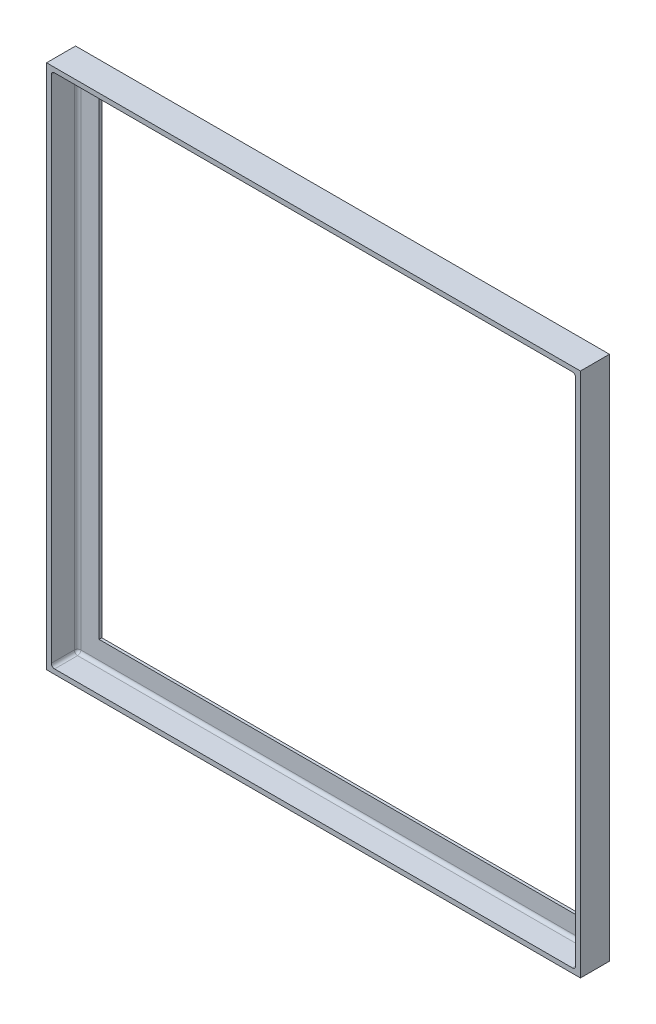
ISO-10303-21;
HEADER;
FILE_DESCRIPTION(('STEP AP214'),'2;1');
FILE_NAME('part.step','',(''),(''),'','','');
FILE_SCHEMA(('AUTOMOTIVE_DESIGN { 1 0 10303 214 1 1 1 1 }'));
ENDSEC;
DATA;
#1=APPLICATION_CONTEXT('core data for automotive mechanical design processes');
#2=APPLICATION_PROTOCOL_DEFINITION('international standard','automotive_design',2000,#1);
#3=PRODUCT_CONTEXT('',#1,'mechanical');
#4=PRODUCT('Part','Part','',(#3));
#5=PRODUCT_RELATED_PRODUCT_CATEGORY('part','',(#4));
#6=PRODUCT_DEFINITION_FORMATION('','',#4);
#7=PRODUCT_DEFINITION_CONTEXT('part definition',#1,'design');
#8=PRODUCT_DEFINITION('design','',#6,#7);
#9=PRODUCT_DEFINITION_SHAPE('','',#8);
#10=(LENGTH_UNIT() NAMED_UNIT(*) SI_UNIT(.MILLI.,.METRE.));
#11=(NAMED_UNIT(*) PLANE_ANGLE_UNIT() SI_UNIT($,.RADIAN.));
#12=(NAMED_UNIT(*) SI_UNIT($,.STERADIAN.) SOLID_ANGLE_UNIT());
#13=UNCERTAINTY_MEASURE_WITH_UNIT(LENGTH_MEASURE(1.E-05),#10,'distance_accuracy_value','');
#14=(GEOMETRIC_REPRESENTATION_CONTEXT(3) GLOBAL_UNCERTAINTY_ASSIGNED_CONTEXT((#13)) GLOBAL_UNIT_ASSIGNED_CONTEXT((#10,
#11,#12)) REPRESENTATION_CONTEXT('',''));
#15=CARTESIAN_POINT('',(0.,0.,0.));
#16=DIRECTION('',(0.,0.,1.));
#17=DIRECTION('',(1.,0.,0.));
#18=AXIS2_PLACEMENT_3D('',#15,#16,#17);
#19=CARTESIAN_POINT('',(0.,228.6,2.65684));
#20=DIRECTION('',(0.,1.,0.));
#21=DIRECTION('',(-1.,0.,0.));
#22=AXIS2_PLACEMENT_3D('',#19,#20,#21);
#23=PLANE('',#22);
#24=DIRECTION('',(1.,0.,0.));
#25=VECTOR('',#24,1.);
#26=CARTESIAN_POINT('',(0.,228.6,0.));
#27=LINE('',#26,#25);
#28=CARTESIAN_POINT('',(-232.56875,228.6,0.));
#29=VERTEX_POINT('',#28);
#30=CARTESIAN_POINT('',(232.56875,228.6,0.));
#31=VERTEX_POINT('',#30);
#32=EDGE_CURVE('E209',#29,#31,#27,.T.);
#33=ORIENTED_EDGE('',*,*,#32,.T.);
#34=DIRECTION('',(0.,0.,-1.));
#35=VECTOR('',#34,1.);
#36=CARTESIAN_POINT('',(232.56875,228.6,2.65684));
#37=LINE('',#36,#35);
#38=CARTESIAN_POINT('',(232.56875,228.6,2.65684));
#39=VERTEX_POINT('',#38);
#40=EDGE_CURVE('E226',#39,#31,#37,.T.);
#41=ORIENTED_EDGE('',*,*,#40,.F.);
#42=DIRECTION('',(1.,0.,0.));
#43=VECTOR('',#42,1.);
#44=CARTESIAN_POINT('',(0.,228.6,2.65684));
#45=LINE('',#44,#43);
#46=CARTESIAN_POINT('',(-232.56875,228.6,2.65684));
#47=VERTEX_POINT('',#46);
#48=EDGE_CURVE('E191',#47,#39,#45,.T.);
#49=ORIENTED_EDGE('',*,*,#48,.F.);
#50=DIRECTION('',(0.,0.,-1.));
#51=VECTOR('',#50,1.);
#52=CARTESIAN_POINT('',(-232.56875,228.6,2.65684));
#53=LINE('',#52,#51);
#54=EDGE_CURVE('E217',#47,#29,#53,.T.);
#55=ORIENTED_EDGE('',*,*,#54,.T.);
#56=EDGE_LOOP('',(#33,#41,#49,#55));
#57=FACE_BOUND('',#56,.T.);
#58=ADVANCED_FACE('F33',(#57),#23,.F.);
#59=CARTESIAN_POINT('',(232.56875,0.,2.65684));
#60=DIRECTION('',(1.,0.,0.));
#61=DIRECTION('',(0.,1.,0.));
#62=AXIS2_PLACEMENT_3D('',#59,#60,#61);
#63=PLANE('',#62);
#64=DIRECTION('',(0.,-1.,0.));
#65=VECTOR('',#64,1.);
#66=CARTESIAN_POINT('',(232.56875,0.,0.));
#67=LINE('',#66,#65);
#68=CARTESIAN_POINT('',(232.56875,-228.6,0.));
#69=VERTEX_POINT('',#68);
#70=EDGE_CURVE('E212',#31,#69,#67,.T.);
#71=ORIENTED_EDGE('',*,*,#70,.T.);
#72=DIRECTION('',(0.,0.,-1.));
#73=VECTOR('',#72,1.);
#74=CARTESIAN_POINT('',(232.56875,-228.6,2.65684));
#75=LINE('',#74,#73);
#76=CARTESIAN_POINT('',(232.56875,-228.6,2.65684));
#77=VERTEX_POINT('',#76);
#78=EDGE_CURVE('E223',#77,#69,#75,.T.);
#79=ORIENTED_EDGE('',*,*,#78,.F.);
#80=DIRECTION('',(0.,-1.,0.));
#81=VECTOR('',#80,1.);
#82=CARTESIAN_POINT('',(232.56875,0.,2.65684));
#83=LINE('',#82,#81);
#84=EDGE_CURVE('E194',#39,#77,#83,.T.);
#85=ORIENTED_EDGE('',*,*,#84,.F.);
#86=ORIENTED_EDGE('',*,*,#40,.T.);
#87=EDGE_LOOP('',(#71,#79,#85,#86));
#88=FACE_BOUND('',#87,.T.);
#89=ADVANCED_FACE('F385',(#88),#63,.F.);
#90=CARTESIAN_POINT('',(0.,-228.6,2.65684));
#91=DIRECTION('',(0.,-1.,0.));
#92=DIRECTION('',(1.,0.,0.));
#93=AXIS2_PLACEMENT_3D('',#90,#91,#92);
#94=PLANE('',#93);
#95=DIRECTION('',(-1.,0.,0.));
#96=VECTOR('',#95,1.);
#97=CARTESIAN_POINT('',(0.,-228.6,0.));
#98=LINE('',#97,#96);
#99=CARTESIAN_POINT('',(-232.56875,-228.6,0.));
#100=VERTEX_POINT('',#99);
#101=EDGE_CURVE('E214',#69,#100,#98,.T.);
#102=ORIENTED_EDGE('',*,*,#101,.T.);
#103=DIRECTION('',(0.,0.,-1.));
#104=VECTOR('',#103,1.);
#105=CARTESIAN_POINT('',(-232.56875,-228.6,2.65684));
#106=LINE('',#105,#104);
#107=CARTESIAN_POINT('',(-232.56875,-228.6,2.65684));
#108=VERTEX_POINT('',#107);
#109=EDGE_CURVE('E220',#108,#100,#106,.T.);
#110=ORIENTED_EDGE('',*,*,#109,.F.);
#111=DIRECTION('',(-1.,0.,0.));
#112=VECTOR('',#111,1.);
#113=CARTESIAN_POINT('',(0.,-228.6,2.65684));
#114=LINE('',#113,#112);
#115=EDGE_CURVE('E197',#77,#108,#114,.T.);
#116=ORIENTED_EDGE('',*,*,#115,.F.);
#117=ORIENTED_EDGE('',*,*,#78,.T.);
#118=EDGE_LOOP('',(#102,#110,#116,#117));
#119=FACE_BOUND('',#118,.T.);
#120=ADVANCED_FACE('F391',(#119),#94,.F.);
#121=CARTESIAN_POINT('',(0.,254.,2.65684));
#122=DIRECTION('',(0.,-1.,0.));
#123=DIRECTION('',(1.,0.,0.));
#124=AXIS2_PLACEMENT_3D('',#121,#122,#123);
#125=PLANE('',#124);
#126=DIRECTION('',(-1.,0.,0.));
#127=VECTOR('',#126,1.);
#128=CARTESIAN_POINT('',(0.,254.,0.));
#129=LINE('',#128,#127);
#130=CARTESIAN_POINT('',(257.96875,254.,0.));
#131=VERTEX_POINT('',#130);
#132=CARTESIAN_POINT('',(-257.96875,254.,0.));
#133=VERTEX_POINT('',#132);
#134=EDGE_CURVE('E190',#131,#133,#129,.T.);
#135=ORIENTED_EDGE('',*,*,#134,.T.);
#136=DIRECTION('',(0.,0.,-1.));
#137=VECTOR('',#136,1.);
#138=CARTESIAN_POINT('',(-257.96875,254.,2.65684));
#139=LINE('',#138,#137);
#140=CARTESIAN_POINT('',(-257.96875,254.,28.05684));
#141=VERTEX_POINT('',#140);
#142=EDGE_CURVE('E169',#141,#133,#139,.T.);
#143=ORIENTED_EDGE('',*,*,#142,.F.);
#144=DIRECTION('',(1.,0.,0.));
#145=VECTOR('',#144,1.);
#146=CARTESIAN_POINT('',(0.,254.,28.05684));
#147=LINE('',#146,#145);
#148=CARTESIAN_POINT('',(257.96875,254.,28.05684));
#149=VERTEX_POINT('',#148);
#150=EDGE_CURVE('E179',#141,#149,#147,.T.);
#151=ORIENTED_EDGE('',*,*,#150,.T.);
#152=DIRECTION('',(0.,0.,-1.));
#153=VECTOR('',#152,1.);
#154=CARTESIAN_POINT('',(257.96875,254.,2.65684));
#155=LINE('',#154,#153);
#156=EDGE_CURVE('E201',#149,#131,#155,.T.);
#157=ORIENTED_EDGE('',*,*,#156,.T.);
#158=EDGE_LOOP('',(#135,#143,#151,#157));
#159=FACE_BOUND('',#158,.T.);
#160=ADVANCED_FACE('F405',(#159),#125,.F.);
#161=CARTESIAN_POINT('',(-257.96875,-1.12757025938492E-13,2.65684));
#162=DIRECTION('',(1.,0.,0.));
#163=DIRECTION('',(0.,1.,0.));
#164=AXIS2_PLACEMENT_3D('',#161,#162,#163);
#165=PLANE('',#164);
#166=DIRECTION('',(0.,-1.,0.));
#167=VECTOR('',#166,1.);
#168=CARTESIAN_POINT('',(-257.96875,-1.12757025938492E-13,0.));
#169=LINE('',#168,#167);
#170=CARTESIAN_POINT('',(-257.96875,-254.,0.));
#171=VERTEX_POINT('',#170);
#172=EDGE_CURVE('E165',#133,#171,#169,.T.);
#173=ORIENTED_EDGE('',*,*,#172,.T.);
#174=DIRECTION('',(0.,0.,-1.));
#175=VECTOR('',#174,1.);
#176=CARTESIAN_POINT('',(-257.96875,-254.,2.65684));
#177=LINE('',#176,#175);
#178=CARTESIAN_POINT('',(-257.96875,-254.,28.05684));
#179=VERTEX_POINT('',#178);
#180=EDGE_CURVE('E159',#179,#171,#177,.T.);
#181=ORIENTED_EDGE('',*,*,#180,.F.);
#182=DIRECTION('',(0.,1.,0.));
#183=VECTOR('',#182,1.);
#184=CARTESIAN_POINT('',(-257.96875,0.,28.05684));
#185=LINE('',#184,#183);
#186=EDGE_CURVE('E163',#179,#141,#185,.T.);
#187=ORIENTED_EDGE('',*,*,#186,.T.);
#188=ORIENTED_EDGE('',*,*,#142,.T.);
#189=EDGE_LOOP('',(#173,#181,#187,#188));
#190=FACE_BOUND('',#189,.T.);
#191=ADVANCED_FACE('F161',(#190),#165,.F.);
#192=CARTESIAN_POINT('',(0.,-254.,2.65684));
#193=DIRECTION('',(0.,1.,0.));
#194=DIRECTION('',(0.,0.,1.));
#195=AXIS2_PLACEMENT_3D('',#192,#193,#194);
#196=PLANE('',#195);
#197=DIRECTION('',(1.,0.,0.));
#198=VECTOR('',#197,1.);
#199=CARTESIAN_POINT('',(0.,-254.,0.));
#200=LINE('',#199,#198);
#201=CARTESIAN_POINT('',(257.96875,-254.,0.));
#202=VERTEX_POINT('',#201);
#203=EDGE_CURVE('E205',#171,#202,#200,.T.);
#204=ORIENTED_EDGE('',*,*,#203,.T.);
#205=DIRECTION('',(0.,0.,-1.));
#206=VECTOR('',#205,1.);
#207=CARTESIAN_POINT('',(257.96875,-254.,2.65684));
#208=LINE('',#207,#206);
#209=CARTESIAN_POINT('',(257.96875,-254.,28.05684));
#210=VERTEX_POINT('',#209);
#211=EDGE_CURVE('E170',#210,#202,#208,.T.);
#212=ORIENTED_EDGE('',*,*,#211,.F.);
#213=DIRECTION('',(-1.,0.,0.));
#214=VECTOR('',#213,1.);
#215=CARTESIAN_POINT('',(0.,-254.,28.05684));
#216=LINE('',#215,#214);
#217=EDGE_CURVE('E176',#210,#179,#216,.T.);
#218=ORIENTED_EDGE('',*,*,#217,.T.);
#219=ORIENTED_EDGE('',*,*,#180,.T.);
#220=EDGE_LOOP('',(#204,#212,#218,#219));
#221=FACE_BOUND('',#220,.T.);
#222=ADVANCED_FACE('F182',(#221),#196,.F.);
#223=CARTESIAN_POINT('',(257.96875,0.,2.65684));
#224=DIRECTION('',(-1.,0.,0.));
#225=DIRECTION('',(0.,-1.,0.));
#226=AXIS2_PLACEMENT_3D('',#223,#224,#225);
#227=PLANE('',#226);
#228=DIRECTION('',(0.,1.,0.));
#229=VECTOR('',#228,1.);
#230=CARTESIAN_POINT('',(257.96875,0.,0.));
#231=LINE('',#230,#229);
#232=EDGE_CURVE('E207',#202,#131,#231,.T.);
#233=ORIENTED_EDGE('',*,*,#232,.T.);
#234=ORIENTED_EDGE('',*,*,#156,.F.);
#235=DIRECTION('',(0.,-1.,0.));
#236=VECTOR('',#235,1.);
#237=CARTESIAN_POINT('',(257.96875,0.,28.05684));
#238=LINE('',#237,#236);
#239=EDGE_CURVE('E184',#149,#210,#238,.T.);
#240=ORIENTED_EDGE('',*,*,#239,.T.);
#241=ORIENTED_EDGE('',*,*,#211,.T.);
#242=EDGE_LOOP('',(#233,#234,#240,#241));
#243=FACE_BOUND('',#242,.T.);
#244=ADVANCED_FACE('F396',(#243),#227,.F.);
#245=CARTESIAN_POINT('',(-232.56875,0.,2.65684));
#246=DIRECTION('',(-1.,0.,0.));
#247=DIRECTION('',(0.,-1.,0.));
#248=AXIS2_PLACEMENT_3D('',#245,#246,#247);
#249=PLANE('',#248);
#250=DIRECTION('',(0.,1.,0.));
#251=VECTOR('',#250,1.);
#252=CARTESIAN_POINT('',(-232.56875,0.,0.));
#253=LINE('',#252,#251);
#254=EDGE_CURVE('E195',#100,#29,#253,.T.);
#255=ORIENTED_EDGE('',*,*,#254,.T.);
#256=ORIENTED_EDGE('',*,*,#54,.F.);
#257=DIRECTION('',(0.,1.,0.));
#258=VECTOR('',#257,1.);
#259=CARTESIAN_POINT('',(-232.56875,0.,2.65684));
#260=LINE('',#259,#258);
#261=EDGE_CURVE('E199',#108,#47,#260,.T.);
#262=ORIENTED_EDGE('',*,*,#261,.F.);
#263=ORIENTED_EDGE('',*,*,#109,.T.);
#264=EDGE_LOOP('',(#255,#256,#262,#263));
#265=FACE_BOUND('',#264,.T.);
#266=ADVANCED_FACE('F399',(#265),#249,.F.);
#267=CARTESIAN_POINT('',(0.,0.,2.65684));
#268=DIRECTION('',(0.,0.,1.));
#269=DIRECTION('',(1.,0.,0.));
#270=AXIS2_PLACEMENT_3D('',#267,#268,#269);
#271=PLANE('',#270);
#272=DIRECTION('',(0.,1.,0.));
#273=VECTOR('',#272,1.);
#274=CARTESIAN_POINT('',(250.208148118038,249.414398118081,2.65684));
#275=LINE('',#274,#273);
#276=CARTESIAN_POINT('',(250.208148118038,-246.239398118081,2.65684));
#277=VERTEX_POINT('',#276);
#278=CARTESIAN_POINT('',(250.208148118038,246.239398118081,2.65684));
#279=VERTEX_POINT('',#278);
#280=EDGE_CURVE('E256',#277,#279,#275,.T.);
#281=ORIENTED_EDGE('',*,*,#280,.T.);
#282=DIRECTION('',(-1.,0.,0.));
#283=VECTOR('',#282,1.);
#284=CARTESIAN_POINT('',(-253.383148118038,246.239398118081,2.65684));
#285=LINE('',#284,#283);
#286=CARTESIAN_POINT('',(-250.208148118038,246.239398118081,2.65684));
#287=VERTEX_POINT('',#286);
#288=EDGE_CURVE('E258',#279,#287,#285,.T.);
#289=ORIENTED_EDGE('',*,*,#288,.T.);
#290=DIRECTION('',(0.,-1.,0.));
#291=VECTOR('',#290,1.);
#292=CARTESIAN_POINT('',(-250.208148118038,-249.414398118081,2.65684));
#293=LINE('',#292,#291);
#294=CARTESIAN_POINT('',(-250.208148118038,-246.239398118081,2.65684));
#295=VERTEX_POINT('',#294);
#296=EDGE_CURVE('E252',#287,#295,#293,.T.);
#297=ORIENTED_EDGE('',*,*,#296,.T.);
#298=DIRECTION('',(1.,0.,0.));
#299=VECTOR('',#298,1.);
#300=CARTESIAN_POINT('',(253.383148118038,-246.239398118081,2.65684));
#301=LINE('',#300,#299);
#302=EDGE_CURVE('E254',#295,#277,#301,.T.);
#303=ORIENTED_EDGE('',*,*,#302,.T.);
#304=EDGE_LOOP('',(#281,#289,#297,#303));
#305=FACE_BOUND('',#304,.T.);
#306=ORIENTED_EDGE('',*,*,#48,.T.);
#307=ORIENTED_EDGE('',*,*,#84,.T.);
#308=ORIENTED_EDGE('',*,*,#115,.T.);
#309=ORIENTED_EDGE('',*,*,#261,.T.);
#310=EDGE_LOOP('',(#306,#307,#308,#309));
#311=FACE_BOUND('',#310,.T.);
#312=ADVANCED_FACE('F367',(#305,#311),#271,.T.);
#313=CARTESIAN_POINT('',(0.,0.,0.));
#314=DIRECTION('',(0.,0.,1.));
#315=DIRECTION('',(1.,0.,0.));
#316=AXIS2_PLACEMENT_3D('',#313,#314,#315);
#317=PLANE('',#316);
#318=ORIENTED_EDGE('',*,*,#134,.F.);
#319=ORIENTED_EDGE('',*,*,#232,.F.);
#320=ORIENTED_EDGE('',*,*,#203,.F.);
#321=ORIENTED_EDGE('',*,*,#172,.F.);
#322=EDGE_LOOP('',(#318,#319,#320,#321));
#323=FACE_BOUND('',#322,.T.);
#324=ORIENTED_EDGE('',*,*,#32,.F.);
#325=ORIENTED_EDGE('',*,*,#254,.F.);
#326=ORIENTED_EDGE('',*,*,#101,.F.);
#327=ORIENTED_EDGE('',*,*,#70,.F.);
#328=EDGE_LOOP('',(#324,#325,#326,#327));
#329=FACE_BOUND('',#328,.T.);
#330=ADVANCED_FACE('F374',(#323,#329),#317,.F.);
#331=CARTESIAN_POINT('',(-253.383148118038,0.,28.05684));
#332=DIRECTION('',(1.,0.,0.));
#333=DIRECTION('',(0.,0.,-1.));
#334=AXIS2_PLACEMENT_3D('',#331,#332,#333);
#335=PLANE('',#334);
#336=DIRECTION('',(0.,-1.,0.));
#337=VECTOR('',#336,1.);
#338=CARTESIAN_POINT('',(-253.383148118038,249.414398118081,5.83184));
#339=LINE('',#338,#337);
#340=CARTESIAN_POINT('',(-253.383148118038,-246.239398118081,5.83184));
#341=VERTEX_POINT('',#340);
#342=CARTESIAN_POINT('',(-253.383148118038,246.239398118081,5.83184));
#343=VERTEX_POINT('',#342);
#344=EDGE_CURVE('E240',#341,#343,#339,.F.);
#345=ORIENTED_EDGE('',*,*,#344,.T.);
#346=DIRECTION('',(0.,0.,-1.));
#347=VECTOR('',#346,1.);
#348=CARTESIAN_POINT('',(-253.383148118038,246.239398118081,28.05684));
#349=LINE('',#348,#347);
#350=CARTESIAN_POINT('',(-253.383148118038,246.239398118081,28.05684));
#351=VERTEX_POINT('',#350);
#352=EDGE_CURVE('E244',#343,#351,#349,.F.);
#353=ORIENTED_EDGE('',*,*,#352,.T.);
#354=DIRECTION('',(0.,-1.,0.));
#355=VECTOR('',#354,1.);
#356=CARTESIAN_POINT('',(-253.383148118038,0.,28.05684));
#357=LINE('',#356,#355);
#358=CARTESIAN_POINT('',(-253.383148118038,-246.239398118081,28.05684));
#359=VERTEX_POINT('',#358);
#360=EDGE_CURVE('E304',#351,#359,#357,.T.);
#361=ORIENTED_EDGE('',*,*,#360,.T.);
#362=DIRECTION('',(0.,0.,-1.));
#363=VECTOR('',#362,1.);
#364=CARTESIAN_POINT('',(-253.383148118038,-246.239398118081,2.65684));
#365=LINE('',#364,#363);
#366=EDGE_CURVE('E242',#359,#341,#365,.T.);
#367=ORIENTED_EDGE('',*,*,#366,.T.);
#368=EDGE_LOOP('',(#345,#353,#361,#367));
#369=FACE_BOUND('',#368,.T.);
#370=ADVANCED_FACE('F372',(#369),#335,.T.);
#371=CARTESIAN_POINT('',(0.,249.414398118081,28.05684));
#372=DIRECTION('',(0.,-1.,0.));
#373=DIRECTION('',(0.,0.,-1.));
#374=AXIS2_PLACEMENT_3D('',#371,#372,#373);
#375=PLANE('',#374);
#376=DIRECTION('',(-1.,0.,0.));
#377=VECTOR('',#376,1.);
#378=CARTESIAN_POINT('',(0.,249.414398118081,28.05684));
#379=LINE('',#378,#377);
#380=CARTESIAN_POINT('',(250.208148118038,249.414398118081,28.05684));
#381=VERTEX_POINT('',#380);
#382=CARTESIAN_POINT('',(-250.208148118038,249.414398118081,28.05684));
#383=VERTEX_POINT('',#382);
#384=EDGE_CURVE('E308',#381,#383,#379,.T.);
#385=ORIENTED_EDGE('',*,*,#384,.T.);
#386=DIRECTION('',(0.,0.,-1.));
#387=VECTOR('',#386,1.);
#388=CARTESIAN_POINT('',(-250.208148118038,249.414398118081,2.65684));
#389=LINE('',#388,#387);
#390=CARTESIAN_POINT('',(-250.208148118038,249.414398118081,5.83184));
#391=VERTEX_POINT('',#390);
#392=EDGE_CURVE('E237',#383,#391,#389,.T.);
#393=ORIENTED_EDGE('',*,*,#392,.T.);
#394=DIRECTION('',(-1.,0.,0.));
#395=VECTOR('',#394,1.);
#396=CARTESIAN_POINT('',(253.383148118038,249.414398118081,5.83184));
#397=LINE('',#396,#395);
#398=CARTESIAN_POINT('',(250.208148118038,249.414398118081,5.83184));
#399=VERTEX_POINT('',#398);
#400=EDGE_CURVE('E229',#391,#399,#397,.F.);
#401=ORIENTED_EDGE('',*,*,#400,.T.);
#402=DIRECTION('',(0.,0.,-1.));
#403=VECTOR('',#402,1.);
#404=CARTESIAN_POINT('',(250.208148118038,249.414398118081,28.05684));
#405=LINE('',#404,#403);
#406=EDGE_CURVE('E235',#399,#381,#405,.F.);
#407=ORIENTED_EDGE('',*,*,#406,.T.);
#408=EDGE_LOOP('',(#385,#393,#401,#407));
#409=FACE_BOUND('',#408,.T.);
#410=ADVANCED_FACE('F345',(#409),#375,.T.);
#411=CARTESIAN_POINT('',(253.383148118038,0.,28.05684));
#412=DIRECTION('',(-1.,0.,0.));
#413=DIRECTION('',(0.,0.,1.));
#414=AXIS2_PLACEMENT_3D('',#411,#412,#413);
#415=PLANE('',#414);
#416=DIRECTION('',(0.,1.,0.));
#417=VECTOR('',#416,1.);
#418=CARTESIAN_POINT('',(253.383148118038,0.,28.05684));
#419=LINE('',#418,#417);
#420=CARTESIAN_POINT('',(253.383148118038,-246.239398118081,28.05684));
#421=VERTEX_POINT('',#420);
#422=CARTESIAN_POINT('',(253.383148118038,246.239398118081,28.05684));
#423=VERTEX_POINT('',#422);
#424=EDGE_CURVE('E314',#421,#423,#419,.T.);
#425=ORIENTED_EDGE('',*,*,#424,.T.);
#426=DIRECTION('',(0.,0.,-1.));
#427=VECTOR('',#426,1.);
#428=CARTESIAN_POINT('',(253.383148118038,246.239398118081,2.65684));
#429=LINE('',#428,#427);
#430=CARTESIAN_POINT('',(253.383148118038,246.239398118081,5.83184));
#431=VERTEX_POINT('',#430);
#432=EDGE_CURVE('E250',#423,#431,#429,.T.);
#433=ORIENTED_EDGE('',*,*,#432,.T.);
#434=DIRECTION('',(0.,1.,0.));
#435=VECTOR('',#434,1.);
#436=CARTESIAN_POINT('',(253.383148118038,-249.414398118081,5.83184));
#437=LINE('',#436,#435);
#438=CARTESIAN_POINT('',(253.383148118038,-246.239398118081,5.83184));
#439=VERTEX_POINT('',#438);
#440=EDGE_CURVE('E246',#431,#439,#437,.F.);
#441=ORIENTED_EDGE('',*,*,#440,.T.);
#442=DIRECTION('',(0.,0.,-1.));
#443=VECTOR('',#442,1.);
#444=CARTESIAN_POINT('',(253.383148118038,-246.239398118081,28.05684));
#445=LINE('',#444,#443);
#446=EDGE_CURVE('E248',#439,#421,#445,.F.);
#447=ORIENTED_EDGE('',*,*,#446,.T.);
#448=EDGE_LOOP('',(#425,#433,#441,#447));
#449=FACE_BOUND('',#448,.T.);
#450=ADVANCED_FACE('F355',(#449),#415,.T.);
#451=CARTESIAN_POINT('',(0.,-249.414398118081,28.05684));
#452=DIRECTION('',(0.,1.,0.));
#453=DIRECTION('',(0.,0.,1.));
#454=AXIS2_PLACEMENT_3D('',#451,#452,#453);
#455=PLANE('',#454);
#456=DIRECTION('',(1.,0.,0.));
#457=VECTOR('',#456,1.);
#458=CARTESIAN_POINT('',(0.,-249.414398118081,28.05684));
#459=LINE('',#458,#457);
#460=CARTESIAN_POINT('',(-250.208148118038,-249.414398118081,28.05684));
#461=VERTEX_POINT('',#460);
#462=CARTESIAN_POINT('',(250.208148118038,-249.414398118081,28.05684));
#463=VERTEX_POINT('',#462);
#464=EDGE_CURVE('E180',#461,#463,#459,.T.);
#465=ORIENTED_EDGE('',*,*,#464,.T.);
#466=DIRECTION('',(0.,0.,-1.));
#467=VECTOR('',#466,1.);
#468=CARTESIAN_POINT('',(250.208148118038,-249.414398118081,2.65684));
#469=LINE('',#468,#467);
#470=CARTESIAN_POINT('',(250.208148118038,-249.414398118081,5.83184));
#471=VERTEX_POINT('',#470);
#472=EDGE_CURVE('E55',#463,#471,#469,.T.);
#473=ORIENTED_EDGE('',*,*,#472,.T.);
#474=DIRECTION('',(1.,0.,0.));
#475=VECTOR('',#474,1.);
#476=CARTESIAN_POINT('',(-253.383148118038,-249.414398118081,5.83184));
#477=LINE('',#476,#475);
#478=CARTESIAN_POINT('',(-250.208148118038,-249.414398118081,5.83184));
#479=VERTEX_POINT('',#478);
#480=EDGE_CURVE('E50',#471,#479,#477,.F.);
#481=ORIENTED_EDGE('',*,*,#480,.T.);
#482=DIRECTION('',(0.,0.,-1.));
#483=VECTOR('',#482,1.);
#484=CARTESIAN_POINT('',(-250.208148118038,-249.414398118081,28.05684));
#485=LINE('',#484,#483);
#486=EDGE_CURVE('E262',#479,#461,#485,.F.);
#487=ORIENTED_EDGE('',*,*,#486,.T.);
#488=EDGE_LOOP('',(#465,#473,#481,#487));
#489=FACE_BOUND('',#488,.T.);
#490=ADVANCED_FACE('F319',(#489),#455,.T.);
#491=CARTESIAN_POINT('',(0.,0.,28.05684));
#492=DIRECTION('',(0.,0.,1.));
#493=DIRECTION('',(1.,0.,0.));
#494=AXIS2_PLACEMENT_3D('',#491,#492,#493);
#495=PLANE('',#494);
#496=ORIENTED_EDGE('',*,*,#360,.F.);
#497=CARTESIAN_POINT('',(-250.208148118038,246.239398118081,28.05684));
#498=DIRECTION('',(0.,0.,1.));
#499=DIRECTION('',(1.,0.,0.));
#500=AXIS2_PLACEMENT_3D('',#497,#498,#499);
#501=CIRCLE('',#500,3.175);
#502=EDGE_CURVE('E265',#351,#383,#501,.F.);
#503=ORIENTED_EDGE('',*,*,#502,.T.);
#504=ORIENTED_EDGE('',*,*,#384,.F.);
#505=CARTESIAN_POINT('',(250.208148118038,246.239398118081,28.05684));
#506=DIRECTION('',(0.,0.,1.));
#507=DIRECTION('',(1.,0.,0.));
#508=AXIS2_PLACEMENT_3D('',#505,#506,#507);
#509=CIRCLE('',#508,3.175);
#510=EDGE_CURVE('E267',#381,#423,#509,.F.);
#511=ORIENTED_EDGE('',*,*,#510,.T.);
#512=ORIENTED_EDGE('',*,*,#424,.F.);
#513=CARTESIAN_POINT('',(250.208148118038,-246.239398118081,28.05684));
#514=DIRECTION('',(0.,0.,1.));
#515=DIRECTION('',(1.,0.,0.));
#516=AXIS2_PLACEMENT_3D('',#513,#514,#515);
#517=CIRCLE('',#516,3.175);
#518=EDGE_CURVE('E42',#421,#463,#517,.F.);
#519=ORIENTED_EDGE('',*,*,#518,.T.);
#520=ORIENTED_EDGE('',*,*,#464,.F.);
#521=CARTESIAN_POINT('',(-250.208148118038,-246.239398118081,28.05684));
#522=DIRECTION('',(0.,0.,1.));
#523=DIRECTION('',(1.,0.,0.));
#524=AXIS2_PLACEMENT_3D('',#521,#522,#523);
#525=CIRCLE('',#524,3.175);
#526=EDGE_CURVE('E11',#461,#359,#525,.F.);
#527=ORIENTED_EDGE('',*,*,#526,.T.);
#528=EDGE_LOOP('',(#496,#503,#504,#511,#512,#519,#520,#527));
#529=FACE_BOUND('',#528,.T.);
#530=ORIENTED_EDGE('',*,*,#186,.F.);
#531=ORIENTED_EDGE('',*,*,#217,.F.);
#532=ORIENTED_EDGE('',*,*,#239,.F.);
#533=ORIENTED_EDGE('',*,*,#150,.F.);
#534=EDGE_LOOP('',(#530,#531,#532,#533));
#535=FACE_BOUND('',#534,.T.);
#536=ADVANCED_FACE('F174',(#529,#535),#495,.T.);
#537=CARTESIAN_POINT('',(250.208148118038,-246.239398118081,28.05684));
#538=DIRECTION('',(0.,0.,1.));
#539=DIRECTION('',(1.,0.,0.));
#540=AXIS2_PLACEMENT_3D('',#537,#538,#539);
#541=CYLINDRICAL_SURFACE('',#540,3.175);
#542=CARTESIAN_POINT('',(250.208148118038,-246.239398118081,5.83184));
#543=DIRECTION('',(0.,0.,1.));
#544=DIRECTION('',(1.,0.,0.));
#545=AXIS2_PLACEMENT_3D('',#542,#543,#544);
#546=CIRCLE('',#545,3.175);
#547=EDGE_CURVE('E37',#471,#439,#546,.T.);
#548=ORIENTED_EDGE('',*,*,#547,.F.);
#549=ORIENTED_EDGE('',*,*,#472,.F.);
#550=ORIENTED_EDGE('',*,*,#518,.F.);
#551=ORIENTED_EDGE('',*,*,#446,.F.);
#552=EDGE_LOOP('',(#548,#549,#550,#551));
#553=FACE_BOUND('',#552,.T.);
#554=ADVANCED_FACE('F35',(#553),#541,.F.);
#555=CARTESIAN_POINT('',(250.208148118038,-246.239398118081,5.83184));
#556=DIRECTION('',(0.,0.,1.));
#557=DIRECTION('',(1.,0.,0.));
#558=AXIS2_PLACEMENT_3D('',#555,#556,#557);
#559=SPHERICAL_SURFACE('',#558,3.175);
#560=CARTESIAN_POINT('',(250.208148118038,-246.239398118081,5.83184));
#561=DIRECTION('',(-1.,0.,0.));
#562=DIRECTION('',(0.,-1.,0.));
#563=AXIS2_PLACEMENT_3D('',#560,#561,#562);
#564=CIRCLE('',#563,3.175);
#565=EDGE_CURVE('E295',#471,#277,#564,.F.);
#566=ORIENTED_EDGE('',*,*,#565,.F.);
#567=ORIENTED_EDGE('',*,*,#547,.T.);
#568=CARTESIAN_POINT('',(250.208148118038,-246.239398118081,5.83184));
#569=DIRECTION('',(0.,1.,0.));
#570=DIRECTION('',(0.,0.,1.));
#571=AXIS2_PLACEMENT_3D('',#568,#569,#570);
#572=CIRCLE('',#571,3.175);
#573=EDGE_CURVE('E297',#277,#439,#572,.F.);
#574=ORIENTED_EDGE('',*,*,#573,.F.);
#575=EDGE_LOOP('',(#566,#567,#574));
#576=FACE_BOUND('',#575,.T.);
#577=ADVANCED_FACE('F325',(#576),#559,.F.);
#578=CARTESIAN_POINT('',(250.208148118038,246.239398118081,28.05684));
#579=DIRECTION('',(0.,0.,1.));
#580=DIRECTION('',(1.,0.,0.));
#581=AXIS2_PLACEMENT_3D('',#578,#579,#580);
#582=CYLINDRICAL_SURFACE('',#581,3.175);
#583=ORIENTED_EDGE('',*,*,#510,.F.);
#584=ORIENTED_EDGE('',*,*,#406,.F.);
#585=CARTESIAN_POINT('',(250.208148118038,246.239398118081,5.83184));
#586=DIRECTION('',(0.,0.,1.));
#587=DIRECTION('',(1.,0.,0.));
#588=AXIS2_PLACEMENT_3D('',#585,#586,#587);
#589=CIRCLE('',#588,3.175);
#590=EDGE_CURVE('E292',#431,#399,#589,.T.);
#591=ORIENTED_EDGE('',*,*,#590,.F.);
#592=ORIENTED_EDGE('',*,*,#432,.F.);
#593=EDGE_LOOP('',(#583,#584,#591,#592));
#594=FACE_BOUND('',#593,.T.);
#595=ADVANCED_FACE('F352',(#594),#582,.F.);
#596=CARTESIAN_POINT('',(250.208148118038,0.,5.83184));
#597=DIRECTION('',(0.,-1.,0.));
#598=DIRECTION('',(0.,0.,-1.));
#599=AXIS2_PLACEMENT_3D('',#596,#597,#598);
#600=CYLINDRICAL_SURFACE('',#599,3.175);
#601=ORIENTED_EDGE('',*,*,#573,.T.);
#602=ORIENTED_EDGE('',*,*,#440,.F.);
#603=CARTESIAN_POINT('',(250.208148118038,246.239398118081,5.83184));
#604=DIRECTION('',(0.,-1.,0.));
#605=DIRECTION('',(0.,0.,-1.));
#606=AXIS2_PLACEMENT_3D('',#603,#604,#605);
#607=CIRCLE('',#606,3.175);
#608=EDGE_CURVE('E289',#279,#431,#607,.T.);
#609=ORIENTED_EDGE('',*,*,#608,.F.);
#610=ORIENTED_EDGE('',*,*,#280,.F.);
#611=EDGE_LOOP('',(#601,#602,#609,#610));
#612=FACE_BOUND('',#611,.T.);
#613=ADVANCED_FACE('F357',(#612),#600,.F.);
#614=CARTESIAN_POINT('',(0.,-246.239398118081,5.83184));
#615=DIRECTION('',(-1.,0.,0.));
#616=DIRECTION('',(0.,0.,1.));
#617=AXIS2_PLACEMENT_3D('',#614,#615,#616);
#618=CYLINDRICAL_SURFACE('',#617,3.175);
#619=ORIENTED_EDGE('',*,*,#565,.T.);
#620=ORIENTED_EDGE('',*,*,#302,.F.);
#621=CARTESIAN_POINT('',(-250.208148118038,-246.239398118081,5.83184));
#622=DIRECTION('',(1.,0.,0.));
#623=DIRECTION('',(0.,0.,-1.));
#624=AXIS2_PLACEMENT_3D('',#621,#622,#623);
#625=CIRCLE('',#624,3.175);
#626=EDGE_CURVE('E286',#479,#295,#625,.T.);
#627=ORIENTED_EDGE('',*,*,#626,.F.);
#628=ORIENTED_EDGE('',*,*,#480,.F.);
#629=EDGE_LOOP('',(#619,#620,#627,#628));
#630=FACE_BOUND('',#629,.T.);
#631=ADVANCED_FACE('F329',(#630),#618,.F.);
#632=CARTESIAN_POINT('',(-250.208148118038,-246.239398118081,28.05684));
#633=DIRECTION('',(0.,0.,1.));
#634=DIRECTION('',(1.,0.,0.));
#635=AXIS2_PLACEMENT_3D('',#632,#633,#634);
#636=CYLINDRICAL_SURFACE('',#635,3.175);
#637=ORIENTED_EDGE('',*,*,#526,.F.);
#638=ORIENTED_EDGE('',*,*,#486,.F.);
#639=CARTESIAN_POINT('',(-250.208148118038,-246.239398118081,5.83184));
#640=DIRECTION('',(0.,0.,1.));
#641=DIRECTION('',(1.,0.,0.));
#642=AXIS2_PLACEMENT_3D('',#639,#640,#641);
#643=CIRCLE('',#642,3.175);
#644=EDGE_CURVE('E283',#341,#479,#643,.T.);
#645=ORIENTED_EDGE('',*,*,#644,.F.);
#646=ORIENTED_EDGE('',*,*,#366,.F.);
#647=EDGE_LOOP('',(#637,#638,#645,#646));
#648=FACE_BOUND('',#647,.T.);
#649=ADVANCED_FACE('F336',(#648),#636,.F.);
#650=CARTESIAN_POINT('',(250.208148118038,246.239398118081,5.83184));
#651=DIRECTION('',(0.,0.,1.));
#652=DIRECTION('',(1.,0.,0.));
#653=AXIS2_PLACEMENT_3D('',#650,#651,#652);
#654=SPHERICAL_SURFACE('',#653,3.175);
#655=ORIENTED_EDGE('',*,*,#608,.T.);
#656=ORIENTED_EDGE('',*,*,#590,.T.);
#657=CARTESIAN_POINT('',(250.208148118038,246.239398118081,5.83184));
#658=DIRECTION('',(-1.,0.,0.));
#659=DIRECTION('',(0.,0.,1.));
#660=AXIS2_PLACEMENT_3D('',#657,#658,#659);
#661=CIRCLE('',#660,3.175);
#662=EDGE_CURVE('E280',#279,#399,#661,.F.);
#663=ORIENTED_EDGE('',*,*,#662,.F.);
#664=EDGE_LOOP('',(#655,#656,#663));
#665=FACE_BOUND('',#664,.T.);
#666=ADVANCED_FACE('F361',(#665),#654,.F.);
#667=CARTESIAN_POINT('',(-250.208148118038,-246.239398118081,5.83184));
#668=DIRECTION('',(0.,0.,1.));
#669=DIRECTION('',(1.,0.,0.));
#670=AXIS2_PLACEMENT_3D('',#667,#668,#669);
#671=SPHERICAL_SURFACE('',#670,3.175);
#672=ORIENTED_EDGE('',*,*,#644,.T.);
#673=ORIENTED_EDGE('',*,*,#626,.T.);
#674=CARTESIAN_POINT('',(-250.208148118038,-246.239398118081,5.83184));
#675=DIRECTION('',(0.,1.,0.));
#676=DIRECTION('',(0.,0.,1.));
#677=AXIS2_PLACEMENT_3D('',#674,#675,#676);
#678=CIRCLE('',#677,3.175);
#679=EDGE_CURVE('E277',#341,#295,#678,.F.);
#680=ORIENTED_EDGE('',*,*,#679,.F.);
#681=EDGE_LOOP('',(#672,#673,#680));
#682=FACE_BOUND('',#681,.T.);
#683=ADVANCED_FACE('F333',(#682),#671,.F.);
#684=CARTESIAN_POINT('',(0.,246.239398118081,5.83184));
#685=DIRECTION('',(1.,0.,0.));
#686=DIRECTION('',(0.,0.,-1.));
#687=AXIS2_PLACEMENT_3D('',#684,#685,#686);
#688=CYLINDRICAL_SURFACE('',#687,3.175);
#689=ORIENTED_EDGE('',*,*,#662,.T.);
#690=ORIENTED_EDGE('',*,*,#400,.F.);
#691=CARTESIAN_POINT('',(-250.208148118038,246.239398118081,5.83184));
#692=DIRECTION('',(1.,0.,0.));
#693=DIRECTION('',(0.,1.,0.));
#694=AXIS2_PLACEMENT_3D('',#691,#692,#693);
#695=CIRCLE('',#694,3.175);
#696=EDGE_CURVE('E274',#287,#391,#695,.T.);
#697=ORIENTED_EDGE('',*,*,#696,.F.);
#698=ORIENTED_EDGE('',*,*,#288,.F.);
#699=EDGE_LOOP('',(#689,#690,#697,#698));
#700=FACE_BOUND('',#699,.T.);
#701=ADVANCED_FACE('F364',(#700),#688,.F.);
#702=CARTESIAN_POINT('',(-250.208148118038,0.,5.83184));
#703=DIRECTION('',(0.,1.,0.));
#704=DIRECTION('',(0.,0.,1.));
#705=AXIS2_PLACEMENT_3D('',#702,#703,#704);
#706=CYLINDRICAL_SURFACE('',#705,3.175);
#707=ORIENTED_EDGE('',*,*,#679,.T.);
#708=ORIENTED_EDGE('',*,*,#296,.F.);
#709=CARTESIAN_POINT('',(-250.208148118038,246.239398118081,5.83184));
#710=DIRECTION('',(0.,-1.,0.));
#711=DIRECTION('',(0.,0.,-1.));
#712=AXIS2_PLACEMENT_3D('',#709,#710,#711);
#713=CIRCLE('',#712,3.175);
#714=EDGE_CURVE('E272',#343,#287,#713,.T.);
#715=ORIENTED_EDGE('',*,*,#714,.F.);
#716=ORIENTED_EDGE('',*,*,#344,.F.);
#717=EDGE_LOOP('',(#707,#708,#715,#716));
#718=FACE_BOUND('',#717,.T.);
#719=ADVANCED_FACE('F371',(#718),#706,.F.);
#720=CARTESIAN_POINT('',(-250.208148118038,246.239398118081,5.83184));
#721=DIRECTION('',(0.,0.,1.));
#722=DIRECTION('',(1.,0.,0.));
#723=AXIS2_PLACEMENT_3D('',#720,#721,#722);
#724=SPHERICAL_SURFACE('',#723,3.175);
#725=ORIENTED_EDGE('',*,*,#714,.T.);
#726=ORIENTED_EDGE('',*,*,#696,.T.);
#727=CARTESIAN_POINT('',(-250.208148118038,246.239398118081,5.83184));
#728=DIRECTION('',(0.,0.,1.));
#729=DIRECTION('',(1.,0.,0.));
#730=AXIS2_PLACEMENT_3D('',#727,#728,#729);
#731=CIRCLE('',#730,3.175);
#732=EDGE_CURVE('E270',#343,#391,#731,.F.);
#733=ORIENTED_EDGE('',*,*,#732,.F.);
#734=EDGE_LOOP('',(#725,#726,#733));
#735=FACE_BOUND('',#734,.T.);
#736=ADVANCED_FACE('F411',(#735),#724,.F.);
#737=CARTESIAN_POINT('',(-250.208148118038,246.239398118081,28.05684));
#738=DIRECTION('',(0.,0.,1.));
#739=DIRECTION('',(1.,0.,0.));
#740=AXIS2_PLACEMENT_3D('',#737,#738,#739);
#741=CYLINDRICAL_SURFACE('',#740,3.175);
#742=ORIENTED_EDGE('',*,*,#502,.F.);
#743=ORIENTED_EDGE('',*,*,#352,.F.);
#744=ORIENTED_EDGE('',*,*,#732,.T.);
#745=ORIENTED_EDGE('',*,*,#392,.F.);
#746=EDGE_LOOP('',(#742,#743,#744,#745));
#747=FACE_BOUND('',#746,.T.);
#748=ADVANCED_FACE('F342',(#747),#741,.F.);
#749=CLOSED_SHELL('',(#58,#89,#120,#160,#191,#222,#244,#266,#312,#330,#370,#410,#450,#490,#536,
#554,#577,#595,#613,#631,#649,#666,#683,#701,#719,#736,#748));
#750=MANIFOLD_SOLID_BREP('B2',#749);
#751=ADVANCED_BREP_SHAPE_REPRESENTATION('',(#18,#750),#14);
#752=SHAPE_DEFINITION_REPRESENTATION(#9,#751);
ENDSEC;
END-ISO-10303-21;
